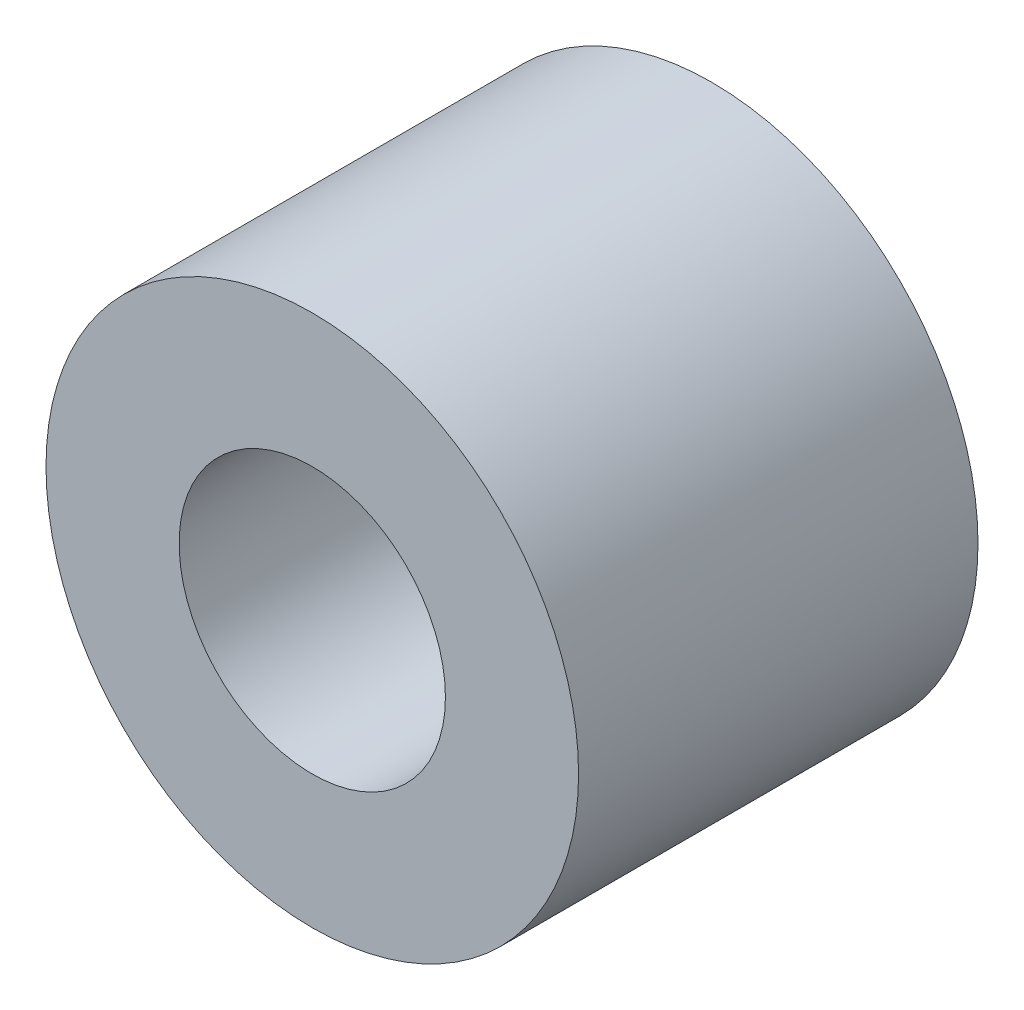
ISO-10303-21;
HEADER;
FILE_DESCRIPTION(('STEP AP214'),'2;1');
FILE_NAME('part.step','',(''),(''),'','','');
FILE_SCHEMA(('AUTOMOTIVE_DESIGN { 1 0 10303 214 1 1 1 1 }'));
ENDSEC;
DATA;
#1=APPLICATION_CONTEXT('core data for automotive mechanical design processes');
#2=APPLICATION_PROTOCOL_DEFINITION('international standard','automotive_design',2000,#1);
#3=PRODUCT_CONTEXT('',#1,'mechanical');
#4=PRODUCT('Part','Part','',(#3));
#5=PRODUCT_RELATED_PRODUCT_CATEGORY('part','',(#4));
#6=PRODUCT_DEFINITION_FORMATION('','',#4);
#7=PRODUCT_DEFINITION_CONTEXT('part definition',#1,'design');
#8=PRODUCT_DEFINITION('design','',#6,#7);
#9=PRODUCT_DEFINITION_SHAPE('','',#8);
#10=(LENGTH_UNIT() NAMED_UNIT(*) SI_UNIT(.MILLI.,.METRE.));
#11=(NAMED_UNIT(*) PLANE_ANGLE_UNIT() SI_UNIT($,.RADIAN.));
#12=(NAMED_UNIT(*) SI_UNIT($,.STERADIAN.) SOLID_ANGLE_UNIT());
#13=UNCERTAINTY_MEASURE_WITH_UNIT(LENGTH_MEASURE(1.E-05),#10,'distance_accuracy_value','');
#14=(GEOMETRIC_REPRESENTATION_CONTEXT(3) GLOBAL_UNCERTAINTY_ASSIGNED_CONTEXT((#13)) GLOBAL_UNIT_ASSIGNED_CONTEXT((#10,
#11,#12)) REPRESENTATION_CONTEXT('',''));
#15=CARTESIAN_POINT('',(0.,0.,0.));
#16=DIRECTION('',(0.,0.,1.));
#17=DIRECTION('',(1.,0.,0.));
#18=AXIS2_PLACEMENT_3D('',#15,#16,#17);
#19=CARTESIAN_POINT('',(0.,0.,6.75));
#20=DIRECTION('',(0.,0.,1.));
#21=DIRECTION('',(1.,0.,0.));
#22=AXIS2_PLACEMENT_3D('',#19,#20,#21);
#23=PLANE('',#22);
#24=CARTESIAN_POINT('',(0.,0.,6.75));
#25=DIRECTION('',(0.,0.,1.));
#26=DIRECTION('',(1.,0.,0.));
#27=AXIS2_PLACEMENT_3D('',#24,#25,#26);
#28=CIRCLE('',#27,4.5);
#29=CARTESIAN_POINT('',(4.5,0.,6.75));
#30=VERTEX_POINT('',#29);
#31=EDGE_CURVE('E10',#30,#30,#28,.T.);
#32=ORIENTED_EDGE('',*,*,#31,.T.);
#33=EDGE_LOOP('',(#32));
#34=FACE_BOUND('',#33,.T.);
#35=CARTESIAN_POINT('',(0.,0.,6.75));
#36=DIRECTION('',(0.,0.,1.));
#37=DIRECTION('',(1.,0.,0.));
#38=AXIS2_PLACEMENT_3D('',#35,#36,#37);
#39=CIRCLE('',#38,2.25);
#40=CARTESIAN_POINT('',(2.25,0.,6.75));
#41=VERTEX_POINT('',#40);
#42=EDGE_CURVE('E43',#41,#41,#39,.T.);
#43=ORIENTED_EDGE('',*,*,#42,.F.);
#44=EDGE_LOOP('',(#43));
#45=FACE_BOUND('',#44,.T.);
#46=ADVANCED_FACE('F32',(#34,#45),#23,.T.);
#47=CARTESIAN_POINT('',(0.,0.,0.));
#48=DIRECTION('',(0.,0.,1.));
#49=DIRECTION('',(1.,0.,0.));
#50=AXIS2_PLACEMENT_3D('',#47,#48,#49);
#51=PLANE('',#50);
#52=CARTESIAN_POINT('',(0.,0.,0.));
#53=DIRECTION('',(0.,0.,1.));
#54=DIRECTION('',(1.,0.,0.));
#55=AXIS2_PLACEMENT_3D('',#52,#53,#54);
#56=CIRCLE('',#55,4.5);
#57=CARTESIAN_POINT('',(4.5,0.,0.));
#58=VERTEX_POINT('',#57);
#59=EDGE_CURVE('E36',#58,#58,#56,.T.);
#60=ORIENTED_EDGE('',*,*,#59,.F.);
#61=EDGE_LOOP('',(#60));
#62=FACE_BOUND('',#61,.T.);
#63=CARTESIAN_POINT('',(0.,0.,0.));
#64=DIRECTION('',(0.,0.,1.));
#65=DIRECTION('',(1.,0.,0.));
#66=AXIS2_PLACEMENT_3D('',#63,#64,#65);
#67=CIRCLE('',#66,2.25);
#68=CARTESIAN_POINT('',(2.25,0.,0.));
#69=VERTEX_POINT('',#68);
#70=EDGE_CURVE('E45',#69,#69,#67,.T.);
#71=ORIENTED_EDGE('',*,*,#70,.T.);
#72=EDGE_LOOP('',(#71));
#73=FACE_BOUND('',#72,.T.);
#74=ADVANCED_FACE('F55',(#62,#73),#51,.F.);
#75=CARTESIAN_POINT('',(0.,0.,6.75));
#76=DIRECTION('',(0.,0.,-1.));
#77=DIRECTION('',(-1.,0.,0.));
#78=AXIS2_PLACEMENT_3D('',#75,#76,#77);
#79=CYLINDRICAL_SURFACE('',#78,4.5);
#80=ORIENTED_EDGE('',*,*,#31,.F.);
#81=EDGE_LOOP('',(#80));
#82=FACE_BOUND('',#81,.T.);
#83=ORIENTED_EDGE('',*,*,#59,.T.);
#84=EDGE_LOOP('',(#83));
#85=FACE_BOUND('',#84,.T.);
#86=ADVANCED_FACE('F34',(#82,#85),#79,.T.);
#87=CARTESIAN_POINT('',(0.,0.,6.75));
#88=DIRECTION('',(0.,0.,-1.));
#89=DIRECTION('',(-1.,0.,0.));
#90=AXIS2_PLACEMENT_3D('',#87,#88,#89);
#91=CYLINDRICAL_SURFACE('',#90,2.25);
#92=ORIENTED_EDGE('',*,*,#42,.T.);
#93=EDGE_LOOP('',(#92));
#94=FACE_BOUND('',#93,.T.);
#95=ORIENTED_EDGE('',*,*,#70,.F.);
#96=EDGE_LOOP('',(#95));
#97=FACE_BOUND('',#96,.T.);
#98=ADVANCED_FACE('F51',(#94,#97),#91,.F.);
#99=CLOSED_SHELL('',(#46,#74,#86,#98));
#100=MANIFOLD_SOLID_BREP('B2',#99);
#101=ADVANCED_BREP_SHAPE_REPRESENTATION('',(#18,#100),#14);
#102=SHAPE_DEFINITION_REPRESENTATION(#9,#101);
ENDSEC;
END-ISO-10303-21;
